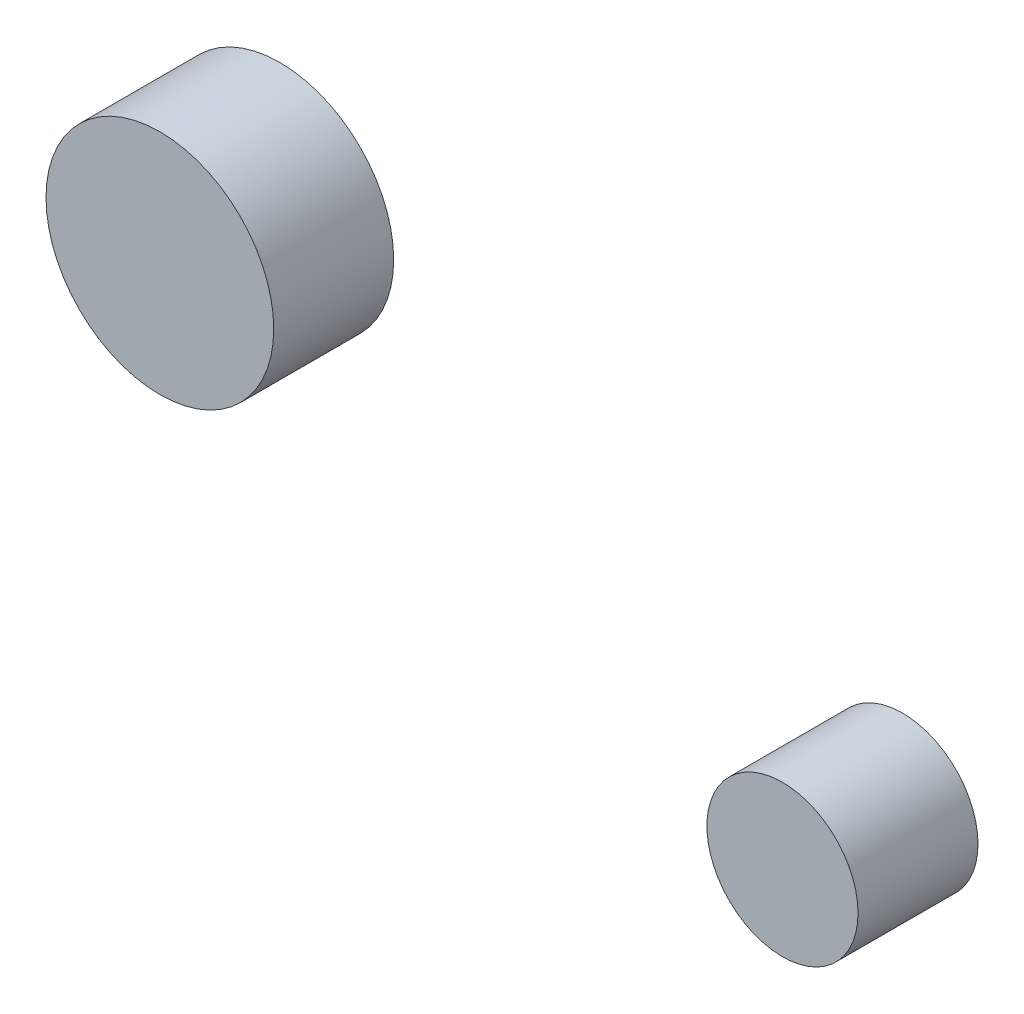
ISO-10303-21;
HEADER;
FILE_DESCRIPTION(('STEP AP214'),'2;1');
FILE_NAME('part.step','',(''),(''),'','','');
FILE_SCHEMA(('AUTOMOTIVE_DESIGN { 1 0 10303 214 1 1 1 1 }'));
ENDSEC;
DATA;
#1=APPLICATION_CONTEXT('core data for automotive mechanical design processes');
#2=APPLICATION_PROTOCOL_DEFINITION('international standard','automotive_design',2000,#1);
#3=PRODUCT_CONTEXT('',#1,'mechanical');
#4=PRODUCT('Part','Part','',(#3));
#5=PRODUCT_RELATED_PRODUCT_CATEGORY('part','',(#4));
#6=PRODUCT_DEFINITION_FORMATION('','',#4);
#7=PRODUCT_DEFINITION_CONTEXT('part definition',#1,'design');
#8=PRODUCT_DEFINITION('design','',#6,#7);
#9=PRODUCT_DEFINITION_SHAPE('','',#8);
#10=(LENGTH_UNIT() NAMED_UNIT(*) SI_UNIT(.MILLI.,.METRE.));
#11=(NAMED_UNIT(*) PLANE_ANGLE_UNIT() SI_UNIT($,.RADIAN.));
#12=(NAMED_UNIT(*) SI_UNIT($,.STERADIAN.) SOLID_ANGLE_UNIT());
#13=UNCERTAINTY_MEASURE_WITH_UNIT(LENGTH_MEASURE(1.E-05),#10,'distance_accuracy_value','');
#14=(GEOMETRIC_REPRESENTATION_CONTEXT(3) GLOBAL_UNCERTAINTY_ASSIGNED_CONTEXT((#13)) GLOBAL_UNIT_ASSIGNED_CONTEXT((#10,
#11,#12)) REPRESENTATION_CONTEXT('',''));
#15=CARTESIAN_POINT('',(0.,0.,0.));
#16=DIRECTION('',(0.,0.,1.));
#17=DIRECTION('',(1.,0.,0.));
#18=AXIS2_PLACEMENT_3D('',#15,#16,#17);
#19=CARTESIAN_POINT('',(29.173,-13.719,11.731));
#20=DIRECTION('',(0.,0.,-1.));
#21=DIRECTION('',(-1.,0.,0.));
#22=AXIS2_PLACEMENT_3D('',#19,#20,#21);
#23=CYLINDRICAL_SURFACE('',#22,7.391);
#24=CARTESIAN_POINT('',(29.173,-13.719,11.731));
#25=DIRECTION('',(0.,0.,1.));
#26=DIRECTION('',(1.,0.,0.));
#27=AXIS2_PLACEMENT_3D('',#24,#25,#26);
#28=CIRCLE('',#27,7.391);
#29=CARTESIAN_POINT('',(36.564,-13.719,11.731));
#30=VERTEX_POINT('',#29);
#31=EDGE_CURVE('E51',#30,#30,#28,.T.);
#32=ORIENTED_EDGE('',*,*,#31,.F.);
#33=EDGE_LOOP('',(#32));
#34=FACE_BOUND('',#33,.T.);
#35=CARTESIAN_POINT('',(29.173,-13.719,0.));
#36=DIRECTION('',(0.,0.,1.));
#37=DIRECTION('',(1.,0.,0.));
#38=AXIS2_PLACEMENT_3D('',#35,#36,#37);
#39=CIRCLE('',#38,7.391);
#40=CARTESIAN_POINT('',(36.564,-13.719,0.));
#41=VERTEX_POINT('',#40);
#42=EDGE_CURVE('E11',#41,#41,#39,.T.);
#43=ORIENTED_EDGE('',*,*,#42,.T.);
#44=EDGE_LOOP('',(#43));
#45=FACE_BOUND('',#44,.T.);
#46=ADVANCED_FACE('F50',(#34,#45),#23,.T.);
#47=CARTESIAN_POINT('',(29.173,-13.719,11.731));
#48=DIRECTION('',(0.,0.,1.));
#49=DIRECTION('',(1.,0.,0.));
#50=AXIS2_PLACEMENT_3D('',#47,#48,#49);
#51=PLANE('',#50);
#52=ORIENTED_EDGE('',*,*,#31,.T.);
#53=EDGE_LOOP('',(#52));
#54=FACE_BOUND('',#53,.T.);
#55=ADVANCED_FACE('F47',(#54),#51,.T.);
#56=CARTESIAN_POINT('',(29.173,-13.719,0.));
#57=DIRECTION('',(0.,0.,1.));
#58=DIRECTION('',(1.,0.,0.));
#59=AXIS2_PLACEMENT_3D('',#56,#57,#58);
#60=PLANE('',#59);
#61=ORIENTED_EDGE('',*,*,#42,.F.);
#62=EDGE_LOOP('',(#61));
#63=FACE_BOUND('',#62,.T.);
#64=ADVANCED_FACE('F67',(#63),#60,.F.);
#65=CLOSED_SHELL('',(#46,#55,#64));
#66=MANIFOLD_SOLID_BREP('B2',#65);
#67=CARTESIAN_POINT('',(-31.719,7.193,11.731));
#68=DIRECTION('',(0.,0.,-1.));
#69=DIRECTION('',(-1.,0.,0.));
#70=AXIS2_PLACEMENT_3D('',#67,#68,#69);
#71=CYLINDRICAL_SURFACE('',#70,11.137);
#72=CARTESIAN_POINT('',(-31.719,7.193,11.731));
#73=DIRECTION('',(0.,0.,1.));
#74=DIRECTION('',(1.,0.,0.));
#75=AXIS2_PLACEMENT_3D('',#72,#73,#74);
#76=CIRCLE('',#75,11.137);
#77=CARTESIAN_POINT('',(-20.582,7.193,11.731));
#78=VERTEX_POINT('',#77);
#79=EDGE_CURVE('E46',#78,#78,#76,.T.);
#80=ORIENTED_EDGE('',*,*,#79,.F.);
#81=EDGE_LOOP('',(#80));
#82=FACE_BOUND('',#81,.T.);
#83=CARTESIAN_POINT('',(-31.719,7.193,0.));
#84=DIRECTION('',(0.,0.,1.));
#85=DIRECTION('',(1.,0.,0.));
#86=AXIS2_PLACEMENT_3D('',#83,#84,#85);
#87=CIRCLE('',#86,11.137);
#88=CARTESIAN_POINT('',(-20.582,7.193,0.));
#89=VERTEX_POINT('',#88);
#90=EDGE_CURVE('E91',#89,#89,#87,.T.);
#91=ORIENTED_EDGE('',*,*,#90,.T.);
#92=EDGE_LOOP('',(#91));
#93=FACE_BOUND('',#92,.T.);
#94=ADVANCED_FACE('F88',(#82,#93),#71,.T.);
#95=CARTESIAN_POINT('',(-31.719,7.193,11.731));
#96=DIRECTION('',(0.,0.,1.));
#97=DIRECTION('',(1.,0.,0.));
#98=AXIS2_PLACEMENT_3D('',#95,#96,#97);
#99=PLANE('',#98);
#100=ORIENTED_EDGE('',*,*,#79,.T.);
#101=EDGE_LOOP('',(#100));
#102=FACE_BOUND('',#101,.T.);
#103=ADVANCED_FACE('F104',(#102),#99,.T.);
#104=CARTESIAN_POINT('',(-31.719,7.193,0.));
#105=DIRECTION('',(0.,0.,1.));
#106=DIRECTION('',(1.,0.,0.));
#107=AXIS2_PLACEMENT_3D('',#104,#105,#106);
#108=PLANE('',#107);
#109=ORIENTED_EDGE('',*,*,#90,.F.);
#110=EDGE_LOOP('',(#109));
#111=FACE_BOUND('',#110,.T.);
#112=ADVANCED_FACE('F102',(#111),#108,.F.);
#113=CLOSED_SHELL('',(#94,#103,#112));
#114=MANIFOLD_SOLID_BREP('B6',#113);
#115=ADVANCED_BREP_SHAPE_REPRESENTATION('',(#18,#66,#114),#14);
#116=SHAPE_DEFINITION_REPRESENTATION(#9,#115);
ENDSEC;
END-ISO-10303-21;
